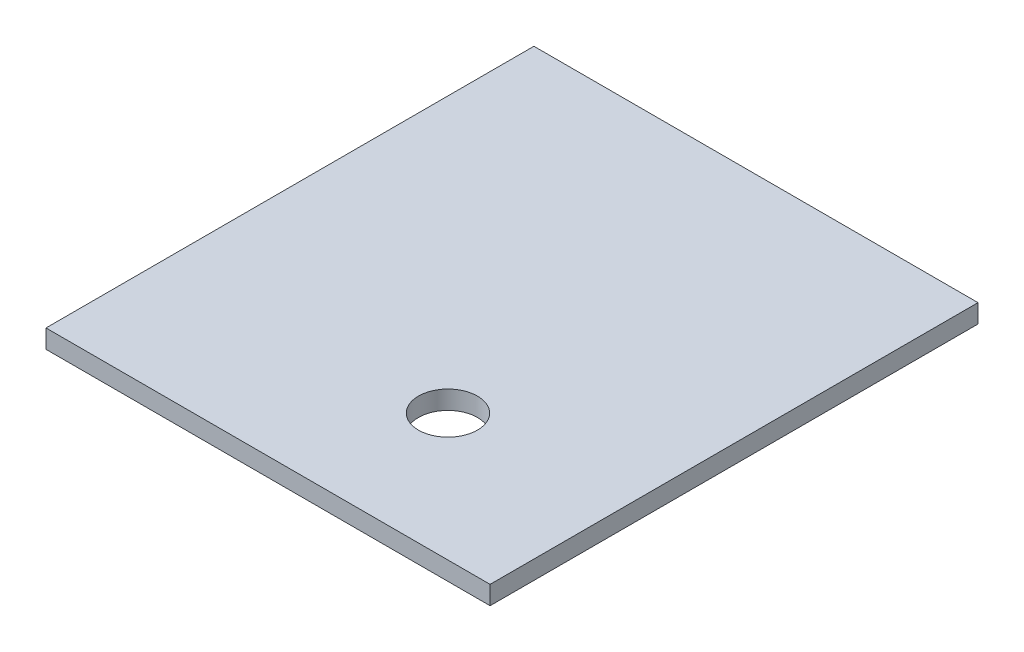
ISO-10303-21;
HEADER;
FILE_DESCRIPTION(('STEP AP214'),'2;1');
FILE_NAME('part.step','',(''),(''),'','','');
FILE_SCHEMA(('AUTOMOTIVE_DESIGN { 1 0 10303 214 1 1 1 1 }'));
ENDSEC;
DATA;
#1=APPLICATION_CONTEXT('core data for automotive mechanical design processes');
#2=APPLICATION_PROTOCOL_DEFINITION('international standard','automotive_design',2000,#1);
#3=PRODUCT_CONTEXT('',#1,'mechanical');
#4=PRODUCT('Part','Part','',(#3));
#5=PRODUCT_RELATED_PRODUCT_CATEGORY('part','',(#4));
#6=PRODUCT_DEFINITION_FORMATION('','',#4);
#7=PRODUCT_DEFINITION_CONTEXT('part definition',#1,'design');
#8=PRODUCT_DEFINITION('design','',#6,#7);
#9=PRODUCT_DEFINITION_SHAPE('','',#8);
#10=(LENGTH_UNIT() NAMED_UNIT(*) SI_UNIT(.MILLI.,.METRE.));
#11=(NAMED_UNIT(*) PLANE_ANGLE_UNIT() SI_UNIT($,.RADIAN.));
#12=(NAMED_UNIT(*) SI_UNIT($,.STERADIAN.) SOLID_ANGLE_UNIT());
#13=UNCERTAINTY_MEASURE_WITH_UNIT(LENGTH_MEASURE(1.E-05),#10,'distance_accuracy_value','');
#14=(GEOMETRIC_REPRESENTATION_CONTEXT(3) GLOBAL_UNCERTAINTY_ASSIGNED_CONTEXT((#13)) GLOBAL_UNIT_ASSIGNED_CONTEXT((#10,
#11,#12)) REPRESENTATION_CONTEXT('',''));
#15=CARTESIAN_POINT('',(0.,0.,0.));
#16=DIRECTION('',(0.,0.,1.));
#17=DIRECTION('',(1.,0.,0.));
#18=AXIS2_PLACEMENT_3D('',#15,#16,#17);
#19=CARTESIAN_POINT('',(66.929,5.588,73.533));
#20=DIRECTION('',(-1.,0.,0.));
#21=DIRECTION('',(0.,0.,1.));
#22=AXIS2_PLACEMENT_3D('',#19,#20,#21);
#23=PLANE('',#22);
#24=DIRECTION('',(0.,0.,-1.));
#25=VECTOR('',#24,1.);
#26=CARTESIAN_POINT('',(66.929,0.,73.533));
#27=LINE('',#26,#25);
#28=CARTESIAN_POINT('',(66.929,0.,73.533));
#29=VERTEX_POINT('',#28);
#30=CARTESIAN_POINT('',(66.929,0.,-73.533));
#31=VERTEX_POINT('',#30);
#32=EDGE_CURVE('E135',#29,#31,#27,.T.);
#33=ORIENTED_EDGE('',*,*,#32,.T.);
#34=DIRECTION('',(0.,-1.,0.));
#35=VECTOR('',#34,1.);
#36=CARTESIAN_POINT('',(66.929,5.588,-73.533));
#37=LINE('',#36,#35);
#38=CARTESIAN_POINT('',(66.929,5.588,-73.533));
#39=VERTEX_POINT('',#38);
#40=EDGE_CURVE('E13',#39,#31,#37,.T.);
#41=ORIENTED_EDGE('',*,*,#40,.F.);
#42=DIRECTION('',(0.,0.,-1.));
#43=VECTOR('',#42,1.);
#44=CARTESIAN_POINT('',(66.929,5.588,73.533));
#45=LINE('',#44,#43);
#46=CARTESIAN_POINT('',(66.929,5.588,73.533));
#47=VERTEX_POINT('',#46);
#48=EDGE_CURVE('E101',#47,#39,#45,.T.);
#49=ORIENTED_EDGE('',*,*,#48,.F.);
#50=DIRECTION('',(0.,-1.,0.));
#51=VECTOR('',#50,1.);
#52=CARTESIAN_POINT('',(66.929,5.588,73.533));
#53=LINE('',#52,#51);
#54=EDGE_CURVE('E109',#47,#29,#53,.T.);
#55=ORIENTED_EDGE('',*,*,#54,.T.);
#56=EDGE_LOOP('',(#33,#41,#49,#55));
#57=FACE_BOUND('',#56,.T.);
#58=ADVANCED_FACE('F50',(#57),#23,.F.);
#59=CARTESIAN_POINT('',(-66.929,5.588,-73.533));
#60=DIRECTION('',(0.,0.,1.));
#61=DIRECTION('',(1.,0.,0.));
#62=AXIS2_PLACEMENT_3D('',#59,#60,#61);
#63=PLANE('',#62);
#64=DIRECTION('',(-1.,0.,0.));
#65=VECTOR('',#64,1.);
#66=CARTESIAN_POINT('',(-66.929,0.,-73.533));
#67=LINE('',#66,#65);
#68=CARTESIAN_POINT('',(-66.929,0.,-73.533));
#69=VERTEX_POINT('',#68);
#70=EDGE_CURVE('E105',#31,#69,#67,.T.);
#71=ORIENTED_EDGE('',*,*,#70,.T.);
#72=DIRECTION('',(0.,-1.,0.));
#73=VECTOR('',#72,1.);
#74=CARTESIAN_POINT('',(-66.929,5.588,-73.533));
#75=LINE('',#74,#73);
#76=CARTESIAN_POINT('',(-66.929,5.588,-73.533));
#77=VERTEX_POINT('',#76);
#78=EDGE_CURVE('E58',#77,#69,#75,.T.);
#79=ORIENTED_EDGE('',*,*,#78,.F.);
#80=DIRECTION('',(-1.,0.,0.));
#81=VECTOR('',#80,1.);
#82=CARTESIAN_POINT('',(-66.929,5.588,-73.533));
#83=LINE('',#82,#81);
#84=EDGE_CURVE('E96',#39,#77,#83,.T.);
#85=ORIENTED_EDGE('',*,*,#84,.F.);
#86=ORIENTED_EDGE('',*,*,#40,.T.);
#87=EDGE_LOOP('',(#71,#79,#85,#86));
#88=FACE_BOUND('',#87,.T.);
#89=ADVANCED_FACE('F104',(#88),#63,.F.);
#90=CARTESIAN_POINT('',(-66.929,5.588,73.533));
#91=DIRECTION('',(1.,0.,0.));
#92=DIRECTION('',(0.,0.,-1.));
#93=AXIS2_PLACEMENT_3D('',#90,#91,#92);
#94=PLANE('',#93);
#95=DIRECTION('',(0.,0.,1.));
#96=VECTOR('',#95,1.);
#97=CARTESIAN_POINT('',(-66.929,0.,73.533));
#98=LINE('',#97,#96);
#99=CARTESIAN_POINT('',(-66.929,0.,73.533));
#100=VERTEX_POINT('',#99);
#101=EDGE_CURVE('E83',#69,#100,#98,.T.);
#102=ORIENTED_EDGE('',*,*,#101,.T.);
#103=DIRECTION('',(0.,-1.,0.));
#104=VECTOR('',#103,1.);
#105=CARTESIAN_POINT('',(-66.929,5.588,73.533));
#106=LINE('',#105,#104);
#107=CARTESIAN_POINT('',(-66.929,5.588,73.533));
#108=VERTEX_POINT('',#107);
#109=EDGE_CURVE('E106',#108,#100,#106,.T.);
#110=ORIENTED_EDGE('',*,*,#109,.F.);
#111=DIRECTION('',(0.,0.,1.));
#112=VECTOR('',#111,1.);
#113=CARTESIAN_POINT('',(-66.929,5.588,73.533));
#114=LINE('',#113,#112);
#115=EDGE_CURVE('E99',#77,#108,#114,.T.);
#116=ORIENTED_EDGE('',*,*,#115,.F.);
#117=ORIENTED_EDGE('',*,*,#78,.T.);
#118=EDGE_LOOP('',(#102,#110,#116,#117));
#119=FACE_BOUND('',#118,.T.);
#120=ADVANCED_FACE('F107',(#119),#94,.F.);
#121=CARTESIAN_POINT('',(-66.929,5.588,73.533));
#122=DIRECTION('',(0.,0.,-1.));
#123=DIRECTION('',(-1.,0.,0.));
#124=AXIS2_PLACEMENT_3D('',#121,#122,#123);
#125=PLANE('',#124);
#126=DIRECTION('',(1.,0.,0.));
#127=VECTOR('',#126,1.);
#128=CARTESIAN_POINT('',(-66.929,0.,73.533));
#129=LINE('',#128,#127);
#130=EDGE_CURVE('E89',#100,#29,#129,.T.);
#131=ORIENTED_EDGE('',*,*,#130,.T.);
#132=ORIENTED_EDGE('',*,*,#54,.F.);
#133=DIRECTION('',(1.,0.,0.));
#134=VECTOR('',#133,1.);
#135=CARTESIAN_POINT('',(-66.929,5.588,73.533));
#136=LINE('',#135,#134);
#137=EDGE_CURVE('E66',#108,#47,#136,.T.);
#138=ORIENTED_EDGE('',*,*,#137,.F.);
#139=ORIENTED_EDGE('',*,*,#109,.T.);
#140=EDGE_LOOP('',(#131,#132,#138,#139));
#141=FACE_BOUND('',#140,.T.);
#142=ADVANCED_FACE('F146',(#141),#125,.F.);
#143=CARTESIAN_POINT('',(0.,5.588,0.));
#144=DIRECTION('',(0.,-1.,0.));
#145=DIRECTION('',(0.,0.,-1.));
#146=AXIS2_PLACEMENT_3D('',#143,#144,#145);
#147=PLANE('',#146);
#148=CARTESIAN_POINT('',(15.875,5.588,35.179));
#149=DIRECTION('',(0.,1.,0.));
#150=DIRECTION('',(0.,0.,1.));
#151=AXIS2_PLACEMENT_3D('',#148,#149,#150);
#152=CIRCLE('',#151,8.89);
#153=CARTESIAN_POINT('',(15.875,5.588,44.069));
#154=VERTEX_POINT('',#153);
#155=EDGE_CURVE('E132',#154,#154,#152,.T.);
#156=ORIENTED_EDGE('',*,*,#155,.F.);
#157=EDGE_LOOP('',(#156));
#158=FACE_BOUND('',#157,.T.);
#159=ORIENTED_EDGE('',*,*,#48,.T.);
#160=ORIENTED_EDGE('',*,*,#84,.T.);
#161=ORIENTED_EDGE('',*,*,#115,.T.);
#162=ORIENTED_EDGE('',*,*,#137,.T.);
#163=EDGE_LOOP('',(#159,#160,#161,#162));
#164=FACE_BOUND('',#163,.T.);
#165=ADVANCED_FACE('F97',(#158,#164),#147,.F.);
#166=CARTESIAN_POINT('',(0.,0.,0.));
#167=DIRECTION('',(0.,-1.,0.));
#168=DIRECTION('',(0.,0.,-1.));
#169=AXIS2_PLACEMENT_3D('',#166,#167,#168);
#170=PLANE('',#169);
#171=CARTESIAN_POINT('',(15.875,0.,35.179));
#172=DIRECTION('',(0.,-1.,0.));
#173=DIRECTION('',(0.,0.,-1.));
#174=AXIS2_PLACEMENT_3D('',#171,#172,#173);
#175=CIRCLE('',#174,8.89);
#176=CARTESIAN_POINT('',(15.875,0.,44.069));
#177=VERTEX_POINT('',#176);
#178=EDGE_CURVE('E130',#177,#177,#175,.F.);
#179=ORIENTED_EDGE('',*,*,#178,.T.);
#180=EDGE_LOOP('',(#179));
#181=FACE_BOUND('',#180,.T.);
#182=ORIENTED_EDGE('',*,*,#32,.F.);
#183=ORIENTED_EDGE('',*,*,#130,.F.);
#184=ORIENTED_EDGE('',*,*,#101,.F.);
#185=ORIENTED_EDGE('',*,*,#70,.F.);
#186=EDGE_LOOP('',(#182,#183,#184,#185));
#187=FACE_BOUND('',#186,.T.);
#188=ADVANCED_FACE('F148',(#181,#187),#170,.T.);
#189=CARTESIAN_POINT('',(15.875,-0.00100000000000013,35.179));
#190=DIRECTION('',(0.,1.,0.));
#191=DIRECTION('',(0.,0.,1.));
#192=AXIS2_PLACEMENT_3D('',#189,#190,#191);
#193=CYLINDRICAL_SURFACE('',#192,8.89);
#194=CARTESIAN_POINT('',(15.875,0.,44.069));
#195=CARTESIAN_POINT('',(15.875,0.0582083333333333,44.069));
#196=CARTESIAN_POINT('',(15.875,0.116416666666667,44.069));
#197=CARTESIAN_POINT('',(15.875,0.232833333333333,44.069));
#198=CARTESIAN_POINT('',(15.875,0.291041666666667,44.069));
#199=CARTESIAN_POINT('',(15.875,0.407458333333333,44.069));
#200=CARTESIAN_POINT('',(15.875,0.465666666666667,44.069));
#201=CARTESIAN_POINT('',(15.875,0.582083333333333,44.069));
#202=CARTESIAN_POINT('',(15.875,0.640291666666667,44.069));
#203=CARTESIAN_POINT('',(15.875,0.756708333333333,44.069));
#204=CARTESIAN_POINT('',(15.875,0.814916666666667,44.069));
#205=CARTESIAN_POINT('',(15.875,0.931333333333333,44.069));
#206=CARTESIAN_POINT('',(15.875,0.989541666666667,44.069));
#207=CARTESIAN_POINT('',(15.875,1.10595833333333,44.069));
#208=CARTESIAN_POINT('',(15.875,1.16416666666667,44.069));
#209=CARTESIAN_POINT('',(15.875,1.28058333333333,44.069));
#210=CARTESIAN_POINT('',(15.875,1.33879166666667,44.069));
#211=CARTESIAN_POINT('',(15.875,1.45520833333333,44.069));
#212=CARTESIAN_POINT('',(15.875,1.51341666666667,44.069));
#213=CARTESIAN_POINT('',(15.875,1.62983333333333,44.069));
#214=CARTESIAN_POINT('',(15.875,1.68804166666667,44.069));
#215=CARTESIAN_POINT('',(15.875,1.80445833333333,44.069));
#216=CARTESIAN_POINT('',(15.875,1.86266666666667,44.069));
#217=CARTESIAN_POINT('',(15.875,1.97908333333333,44.069));
#218=CARTESIAN_POINT('',(15.875,2.03729166666667,44.069));
#219=CARTESIAN_POINT('',(15.875,2.15370833333333,44.069));
#220=CARTESIAN_POINT('',(15.875,2.21191666666667,44.069));
#221=CARTESIAN_POINT('',(15.875,2.32833333333333,44.069));
#222=CARTESIAN_POINT('',(15.875,2.38654166666667,44.069));
#223=CARTESIAN_POINT('',(15.875,2.50295833333333,44.069));
#224=CARTESIAN_POINT('',(15.875,2.56116666666667,44.069));
#225=CARTESIAN_POINT('',(15.875,2.67758333333333,44.069));
#226=CARTESIAN_POINT('',(15.875,2.73579166666667,44.069));
#227=CARTESIAN_POINT('',(15.875,2.85220833333333,44.069));
#228=CARTESIAN_POINT('',(15.875,2.91041666666667,44.069));
#229=CARTESIAN_POINT('',(15.875,3.02683333333333,44.069));
#230=CARTESIAN_POINT('',(15.875,3.08504166666667,44.069));
#231=CARTESIAN_POINT('',(15.875,3.20145833333333,44.069));
#232=CARTESIAN_POINT('',(15.875,3.25966666666667,44.069));
#233=CARTESIAN_POINT('',(15.875,3.37608333333333,44.069));
#234=CARTESIAN_POINT('',(15.875,3.43429166666667,44.069));
#235=CARTESIAN_POINT('',(15.875,3.55070833333333,44.069));
#236=CARTESIAN_POINT('',(15.875,3.60891666666667,44.069));
#237=CARTESIAN_POINT('',(15.875,3.72533333333333,44.069));
#238=CARTESIAN_POINT('',(15.875,3.78354166666667,44.069));
#239=CARTESIAN_POINT('',(15.875,3.89995833333333,44.069));
#240=CARTESIAN_POINT('',(15.875,3.95816666666667,44.069));
#241=CARTESIAN_POINT('',(15.875,4.07458333333333,44.069));
#242=CARTESIAN_POINT('',(15.875,4.13279166666667,44.069));
#243=CARTESIAN_POINT('',(15.875,4.24920833333333,44.069));
#244=CARTESIAN_POINT('',(15.875,4.30741666666667,44.069));
#245=CARTESIAN_POINT('',(15.875,4.42383333333333,44.069));
#246=CARTESIAN_POINT('',(15.875,4.48204166666667,44.069));
#247=CARTESIAN_POINT('',(15.875,4.59845833333333,44.069));
#248=CARTESIAN_POINT('',(15.875,4.65666666666667,44.069));
#249=CARTESIAN_POINT('',(15.875,4.77308333333333,44.069));
#250=CARTESIAN_POINT('',(15.875,4.83129166666667,44.069));
#251=CARTESIAN_POINT('',(15.875,4.94770833333333,44.069));
#252=CARTESIAN_POINT('',(15.875,5.00591666666667,44.069));
#253=CARTESIAN_POINT('',(15.875,5.12233333333333,44.069));
#254=CARTESIAN_POINT('',(15.875,5.18054166666667,44.069));
#255=CARTESIAN_POINT('',(15.875,5.29695833333333,44.069));
#256=CARTESIAN_POINT('',(15.875,5.35516666666667,44.069));
#257=CARTESIAN_POINT('',(15.875,5.47158333333333,44.069));
#258=CARTESIAN_POINT('',(15.875,5.52979166666667,44.069));
#259=CARTESIAN_POINT('',(15.875,5.588,44.069));
#260=B_SPLINE_CURVE_WITH_KNOTS('',3,(#194,#195,#196,#197,#198,#199,#200,#201,#202,#203,#204,
#205,#206,#207,#208,#209,#210,#211,#212,#213,#214,#215,#216,#217,#218,#219,#220,#221,#222,#223,
#224,#225,#226,#227,#228,#229,#230,#231,#232,#233,#234,#235,#236,#237,#238,#239,#240,#241,#242,
#243,#244,#245,#246,#247,#248,#249,#250,#251,#252,#253,#254,#255,#256,#257,#258,#259),
.UNSPECIFIED.,.F.,.F.,(4,2,2,2,2,2,2,2,2,2,2,2,2,2,2,2,2,2,2,2,2,2,2,2,2,2,2,2,2,2,2,2,4),(0.,
0.174625,0.34925,0.523875,0.6985,0.873125,1.04775,1.222375,1.397,1.571625,1.74625,1.920875,
2.0955,2.270125,2.44475,2.619375,2.794,2.968625,3.14325,3.317875,3.4925,3.667125,3.84175,
4.016375,4.191,4.365625,4.54025,4.714875,4.8895,5.064125,5.23875,5.413375,5.588),.UNSPECIFIED.);
#261=EDGE_CURVE('BSEAM162',#177,#154,#260,.T.);
#262=ORIENTED_EDGE('',*,*,#178,.F.);
#263=ORIENTED_EDGE('',*,*,#155,.T.);
#264=ORIENTED_EDGE('',*,*,#261,.T.);
#265=ORIENTED_EDGE('',*,*,#261,.F.);
#266=EDGE_LOOP('',(#262,#264,#263,#265));
#267=FACE_BOUND('',#266,.T.);
#268=ADVANCED_FACE('F162',(#267),#193,.F.);
#269=CLOSED_SHELL('',(#58,#89,#120,#142,#165,#188,#268));
#270=MANIFOLD_SOLID_BREP('B2',#269);
#271=ADVANCED_BREP_SHAPE_REPRESENTATION('',(#18,#270),#14);
#272=SHAPE_DEFINITION_REPRESENTATION(#9,#271);
ENDSEC;
END-ISO-10303-21;
